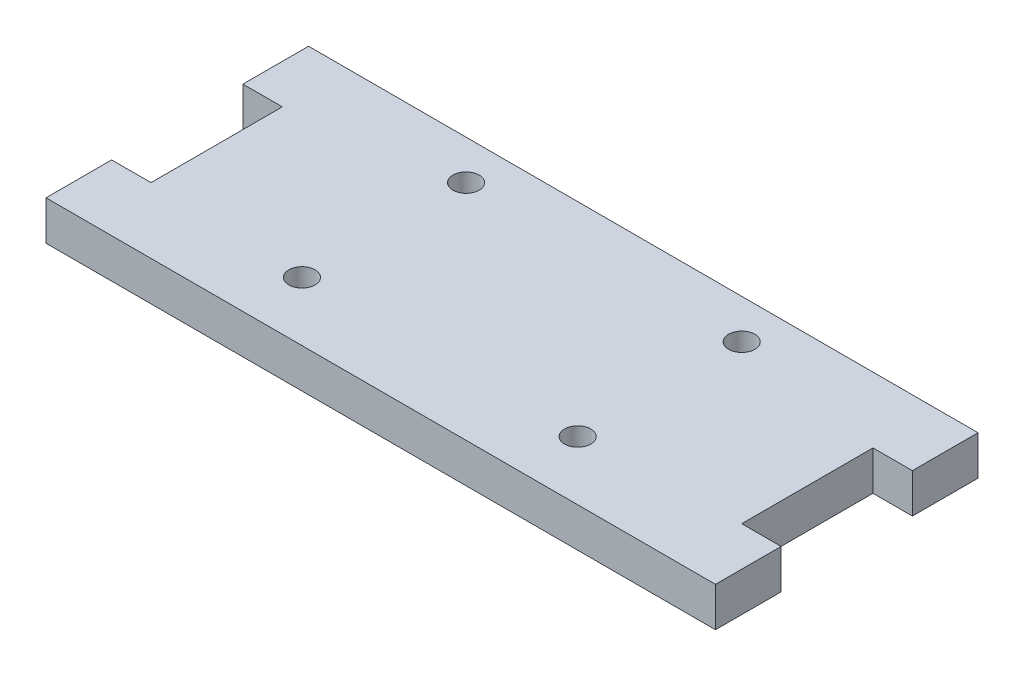
ISO-10303-21;
HEADER;
FILE_DESCRIPTION(('STEP AP214'),'2;1');
FILE_NAME('part.step','',(''),(''),'','','');
FILE_SCHEMA(('AUTOMOTIVE_DESIGN { 1 0 10303 214 1 1 1 1 }'));
ENDSEC;
DATA;
#1=APPLICATION_CONTEXT('core data for automotive mechanical design processes');
#2=APPLICATION_PROTOCOL_DEFINITION('international standard','automotive_design',2000,#1);
#3=PRODUCT_CONTEXT('',#1,'mechanical');
#4=PRODUCT('Part','Part','',(#3));
#5=PRODUCT_RELATED_PRODUCT_CATEGORY('part','',(#4));
#6=PRODUCT_DEFINITION_FORMATION('','',#4);
#7=PRODUCT_DEFINITION_CONTEXT('part definition',#1,'design');
#8=PRODUCT_DEFINITION('design','',#6,#7);
#9=PRODUCT_DEFINITION_SHAPE('','',#8);
#10=(LENGTH_UNIT() NAMED_UNIT(*) SI_UNIT(.MILLI.,.METRE.));
#11=(NAMED_UNIT(*) PLANE_ANGLE_UNIT() SI_UNIT($,.RADIAN.));
#12=(NAMED_UNIT(*) SI_UNIT($,.STERADIAN.) SOLID_ANGLE_UNIT());
#13=UNCERTAINTY_MEASURE_WITH_UNIT(LENGTH_MEASURE(1.E-05),#10,'distance_accuracy_value','');
#14=(GEOMETRIC_REPRESENTATION_CONTEXT(3) GLOBAL_UNCERTAINTY_ASSIGNED_CONTEXT((#13)) GLOBAL_UNIT_ASSIGNED_CONTEXT((#10,
#11,#12)) REPRESENTATION_CONTEXT('',''));
#15=CARTESIAN_POINT('',(0.,0.,0.));
#16=DIRECTION('',(0.,0.,1.));
#17=DIRECTION('',(1.,0.,0.));
#18=AXIS2_PLACEMENT_3D('',#15,#16,#17);
#19=CARTESIAN_POINT('',(0.,3.,-20.));
#20=DIRECTION('',(0.,0.,1.));
#21=DIRECTION('',(1.,0.,0.));
#22=AXIS2_PLACEMENT_3D('',#19,#20,#21);
#23=PLANE('',#22);
#24=DIRECTION('',(-1.,0.,0.));
#25=VECTOR('',#24,1.);
#26=CARTESIAN_POINT('',(0.,0.,-20.));
#27=LINE('',#26,#25);
#28=CARTESIAN_POINT('',(48.,0.,-20.));
#29=VERTEX_POINT('',#28);
#30=CARTESIAN_POINT('',(-3.,0.,-20.));
#31=VERTEX_POINT('',#30);
#32=EDGE_CURVE('E183',#29,#31,#27,.T.);
#33=ORIENTED_EDGE('',*,*,#32,.T.);
#34=DIRECTION('',(0.,-1.,0.));
#35=VECTOR('',#34,1.);
#36=CARTESIAN_POINT('',(-3.,3.,-20.));
#37=LINE('',#36,#35);
#38=CARTESIAN_POINT('',(-3.,3.,-20.));
#39=VERTEX_POINT('',#38);
#40=EDGE_CURVE('E11',#39,#31,#37,.T.);
#41=ORIENTED_EDGE('',*,*,#40,.F.);
#42=DIRECTION('',(-1.,0.,0.));
#43=VECTOR('',#42,1.);
#44=CARTESIAN_POINT('',(0.,3.,-20.));
#45=LINE('',#44,#43);
#46=CARTESIAN_POINT('',(48.,3.,-20.));
#47=VERTEX_POINT('',#46);
#48=EDGE_CURVE('E242',#47,#39,#45,.T.);
#49=ORIENTED_EDGE('',*,*,#48,.F.);
#50=DIRECTION('',(0.,-1.,0.));
#51=VECTOR('',#50,1.);
#52=CARTESIAN_POINT('',(48.,3.,-20.));
#53=LINE('',#52,#51);
#54=EDGE_CURVE('E58',#47,#29,#53,.T.);
#55=ORIENTED_EDGE('',*,*,#54,.T.);
#56=EDGE_LOOP('',(#33,#41,#49,#55));
#57=FACE_BOUND('',#56,.T.);
#58=ADVANCED_FACE('F41',(#57),#23,.F.);
#59=CARTESIAN_POINT('',(-3.,3.,0.));
#60=DIRECTION('',(1.,0.,0.));
#61=DIRECTION('',(0.,0.,-1.));
#62=AXIS2_PLACEMENT_3D('',#59,#60,#61);
#63=PLANE('',#62);
#64=DIRECTION('',(0.,0.,1.));
#65=VECTOR('',#64,1.);
#66=CARTESIAN_POINT('',(-3.,0.,0.));
#67=LINE('',#66,#65);
#68=CARTESIAN_POINT('',(-3.,0.,-15.));
#69=VERTEX_POINT('',#68);
#70=EDGE_CURVE('E186',#31,#69,#67,.T.);
#71=ORIENTED_EDGE('',*,*,#70,.T.);
#72=DIRECTION('',(0.,-1.,0.));
#73=VECTOR('',#72,1.);
#74=CARTESIAN_POINT('',(-3.,3.,-15.));
#75=LINE('',#74,#73);
#76=CARTESIAN_POINT('',(-3.,3.,-15.));
#77=VERTEX_POINT('',#76);
#78=EDGE_CURVE('E50',#77,#69,#75,.T.);
#79=ORIENTED_EDGE('',*,*,#78,.F.);
#80=DIRECTION('',(0.,0.,1.));
#81=VECTOR('',#80,1.);
#82=CARTESIAN_POINT('',(-3.,3.,0.));
#83=LINE('',#82,#81);
#84=EDGE_CURVE('E109',#39,#77,#83,.T.);
#85=ORIENTED_EDGE('',*,*,#84,.F.);
#86=ORIENTED_EDGE('',*,*,#40,.T.);
#87=EDGE_LOOP('',(#71,#79,#85,#86));
#88=FACE_BOUND('',#87,.T.);
#89=ADVANCED_FACE('F274',(#88),#63,.F.);
#90=CARTESIAN_POINT('',(0.,3.,-15.));
#91=DIRECTION('',(0.,0.,1.));
#92=DIRECTION('',(1.,0.,0.));
#93=AXIS2_PLACEMENT_3D('',#90,#91,#92);
#94=PLANE('',#93);
#95=DIRECTION('',(-1.,0.,0.));
#96=VECTOR('',#95,1.);
#97=CARTESIAN_POINT('',(0.,0.,-15.));
#98=LINE('',#97,#96);
#99=CARTESIAN_POINT('',(0.,0.,-15.));
#100=VERTEX_POINT('',#99);
#101=EDGE_CURVE('E190',#100,#69,#98,.T.);
#102=ORIENTED_EDGE('',*,*,#101,.F.);
#103=DIRECTION('',(0.,-1.,0.));
#104=VECTOR('',#103,1.);
#105=CARTESIAN_POINT('',(0.,3.,-15.));
#106=LINE('',#105,#104);
#107=CARTESIAN_POINT('',(0.,3.,-15.));
#108=VERTEX_POINT('',#107);
#109=EDGE_CURVE('E265',#108,#100,#106,.T.);
#110=ORIENTED_EDGE('',*,*,#109,.F.);
#111=DIRECTION('',(-1.,0.,0.));
#112=VECTOR('',#111,1.);
#113=CARTESIAN_POINT('',(0.,3.,-15.));
#114=LINE('',#113,#112);
#115=EDGE_CURVE('E273',#108,#77,#114,.T.);
#116=ORIENTED_EDGE('',*,*,#115,.T.);
#117=ORIENTED_EDGE('',*,*,#78,.T.);
#118=EDGE_LOOP('',(#102,#110,#116,#117));
#119=FACE_BOUND('',#118,.T.);
#120=ADVANCED_FACE('F271',(#119),#94,.T.);
#121=CARTESIAN_POINT('',(0.,3.,0.));
#122=DIRECTION('',(-1.,0.,0.));
#123=DIRECTION('',(0.,0.,1.));
#124=AXIS2_PLACEMENT_3D('',#121,#122,#123);
#125=PLANE('',#124);
#126=DIRECTION('',(0.,0.,-1.));
#127=VECTOR('',#126,1.);
#128=CARTESIAN_POINT('',(0.,0.,0.));
#129=LINE('',#128,#127);
#130=CARTESIAN_POINT('',(0.,0.,-5.));
#131=VERTEX_POINT('',#130);
#132=EDGE_CURVE('E194',#131,#100,#129,.T.);
#133=ORIENTED_EDGE('',*,*,#132,.F.);
#134=DIRECTION('',(0.,-1.,0.));
#135=VECTOR('',#134,1.);
#136=CARTESIAN_POINT('',(0.,3.,-5.));
#137=LINE('',#136,#135);
#138=CARTESIAN_POINT('',(0.,3.,-5.));
#139=VERTEX_POINT('',#138);
#140=EDGE_CURVE('E262',#139,#131,#137,.T.);
#141=ORIENTED_EDGE('',*,*,#140,.F.);
#142=DIRECTION('',(0.,0.,-1.));
#143=VECTOR('',#142,1.);
#144=CARTESIAN_POINT('',(0.,3.,0.));
#145=LINE('',#144,#143);
#146=EDGE_CURVE('E286',#139,#108,#145,.T.);
#147=ORIENTED_EDGE('',*,*,#146,.T.);
#148=ORIENTED_EDGE('',*,*,#109,.T.);
#149=EDGE_LOOP('',(#133,#141,#147,#148));
#150=FACE_BOUND('',#149,.T.);
#151=ADVANCED_FACE('F282',(#150),#125,.T.);
#152=CARTESIAN_POINT('',(0.,3.,-5.));
#153=DIRECTION('',(0.,0.,1.));
#154=DIRECTION('',(1.,0.,0.));
#155=AXIS2_PLACEMENT_3D('',#152,#153,#154);
#156=PLANE('',#155);
#157=DIRECTION('',(-1.,0.,0.));
#158=VECTOR('',#157,1.);
#159=CARTESIAN_POINT('',(0.,0.,-5.));
#160=LINE('',#159,#158);
#161=CARTESIAN_POINT('',(-3.,0.,-5.));
#162=VERTEX_POINT('',#161);
#163=EDGE_CURVE('E198',#131,#162,#160,.T.);
#164=ORIENTED_EDGE('',*,*,#163,.T.);
#165=DIRECTION('',(0.,-1.,0.));
#166=VECTOR('',#165,1.);
#167=CARTESIAN_POINT('',(-3.,3.,-5.));
#168=LINE('',#167,#166);
#169=CARTESIAN_POINT('',(-3.,3.,-5.));
#170=VERTEX_POINT('',#169);
#171=EDGE_CURVE('E259',#170,#162,#168,.T.);
#172=ORIENTED_EDGE('',*,*,#171,.F.);
#173=DIRECTION('',(-1.,0.,0.));
#174=VECTOR('',#173,1.);
#175=CARTESIAN_POINT('',(0.,3.,-5.));
#176=LINE('',#175,#174);
#177=EDGE_CURVE('E291',#139,#170,#176,.T.);
#178=ORIENTED_EDGE('',*,*,#177,.F.);
#179=ORIENTED_EDGE('',*,*,#140,.T.);
#180=EDGE_LOOP('',(#164,#172,#178,#179));
#181=FACE_BOUND('',#180,.T.);
#182=ADVANCED_FACE('F340',(#181),#156,.F.);
#183=CARTESIAN_POINT('',(-3.,3.,0.));
#184=DIRECTION('',(-1.,0.,0.));
#185=DIRECTION('',(0.,0.,1.));
#186=AXIS2_PLACEMENT_3D('',#183,#184,#185);
#187=PLANE('',#186);
#188=DIRECTION('',(0.,0.,-1.));
#189=VECTOR('',#188,1.);
#190=CARTESIAN_POINT('',(-3.,0.,0.));
#191=LINE('',#190,#189);
#192=CARTESIAN_POINT('',(-3.,0.,0.));
#193=VERTEX_POINT('',#192);
#194=EDGE_CURVE('E202',#193,#162,#191,.T.);
#195=ORIENTED_EDGE('',*,*,#194,.F.);
#196=DIRECTION('',(0.,-1.,0.));
#197=VECTOR('',#196,1.);
#198=CARTESIAN_POINT('',(-3.,3.,0.));
#199=LINE('',#198,#197);
#200=CARTESIAN_POINT('',(-3.,3.,0.));
#201=VERTEX_POINT('',#200);
#202=EDGE_CURVE('E256',#201,#193,#199,.T.);
#203=ORIENTED_EDGE('',*,*,#202,.F.);
#204=DIRECTION('',(0.,0.,-1.));
#205=VECTOR('',#204,1.);
#206=CARTESIAN_POINT('',(-3.,3.,0.));
#207=LINE('',#206,#205);
#208=EDGE_CURVE('E298',#201,#170,#207,.T.);
#209=ORIENTED_EDGE('',*,*,#208,.T.);
#210=ORIENTED_EDGE('',*,*,#171,.T.);
#211=EDGE_LOOP('',(#195,#203,#209,#210));
#212=FACE_BOUND('',#211,.T.);
#213=ADVANCED_FACE('F343',(#212),#187,.T.);
#214=CARTESIAN_POINT('',(0.,3.,0.));
#215=DIRECTION('',(0.,0.,-1.));
#216=DIRECTION('',(-1.,0.,0.));
#217=AXIS2_PLACEMENT_3D('',#214,#215,#216);
#218=PLANE('',#217);
#219=DIRECTION('',(1.,0.,0.));
#220=VECTOR('',#219,1.);
#221=CARTESIAN_POINT('',(0.,0.,0.));
#222=LINE('',#221,#220);
#223=CARTESIAN_POINT('',(48.,0.,0.));
#224=VERTEX_POINT('',#223);
#225=EDGE_CURVE('E206',#193,#224,#222,.T.);
#226=ORIENTED_EDGE('',*,*,#225,.T.);
#227=DIRECTION('',(0.,-1.,0.));
#228=VECTOR('',#227,1.);
#229=CARTESIAN_POINT('',(48.,3.,0.));
#230=LINE('',#229,#228);
#231=CARTESIAN_POINT('',(48.,3.,0.));
#232=VERTEX_POINT('',#231);
#233=EDGE_CURVE('E252',#232,#224,#230,.T.);
#234=ORIENTED_EDGE('',*,*,#233,.F.);
#235=DIRECTION('',(1.,0.,0.));
#236=VECTOR('',#235,1.);
#237=CARTESIAN_POINT('',(0.,3.,0.));
#238=LINE('',#237,#236);
#239=EDGE_CURVE('E302',#201,#232,#238,.T.);
#240=ORIENTED_EDGE('',*,*,#239,.F.);
#241=ORIENTED_EDGE('',*,*,#202,.T.);
#242=EDGE_LOOP('',(#226,#234,#240,#241));
#243=FACE_BOUND('',#242,.T.);
#244=ADVANCED_FACE('F347',(#243),#218,.F.);
#245=CARTESIAN_POINT('',(48.,3.,0.));
#246=DIRECTION('',(-1.,0.,0.));
#247=DIRECTION('',(0.,0.,1.));
#248=AXIS2_PLACEMENT_3D('',#245,#246,#247);
#249=PLANE('',#248);
#250=DIRECTION('',(0.,0.,-1.));
#251=VECTOR('',#250,1.);
#252=CARTESIAN_POINT('',(48.,0.,0.));
#253=LINE('',#252,#251);
#254=CARTESIAN_POINT('',(48.,0.,-5.00000000000001));
#255=VERTEX_POINT('',#254);
#256=EDGE_CURVE('E209',#224,#255,#253,.T.);
#257=ORIENTED_EDGE('',*,*,#256,.T.);
#258=DIRECTION('',(0.,-1.,0.));
#259=VECTOR('',#258,1.);
#260=CARTESIAN_POINT('',(48.,3.,-5.00000000000001));
#261=LINE('',#260,#259);
#262=CARTESIAN_POINT('',(48.,3.,-5.00000000000001));
#263=VERTEX_POINT('',#262);
#264=EDGE_CURVE('E249',#263,#255,#261,.T.);
#265=ORIENTED_EDGE('',*,*,#264,.F.);
#266=DIRECTION('',(0.,0.,-1.));
#267=VECTOR('',#266,1.);
#268=CARTESIAN_POINT('',(48.,3.,0.));
#269=LINE('',#268,#267);
#270=EDGE_CURVE('E305',#232,#263,#269,.T.);
#271=ORIENTED_EDGE('',*,*,#270,.F.);
#272=ORIENTED_EDGE('',*,*,#233,.T.);
#273=EDGE_LOOP('',(#257,#265,#271,#272));
#274=FACE_BOUND('',#273,.T.);
#275=ADVANCED_FACE('F351',(#274),#249,.F.);
#276=CARTESIAN_POINT('',(0.,3.,-4.99999999999995));
#277=DIRECTION('',(0.,0.,-1.));
#278=DIRECTION('',(-1.,0.,0.));
#279=AXIS2_PLACEMENT_3D('',#276,#277,#278);
#280=PLANE('',#279);
#281=DIRECTION('',(1.,0.,0.));
#282=VECTOR('',#281,1.);
#283=CARTESIAN_POINT('',(0.,0.,-4.99999999999995));
#284=LINE('',#283,#282);
#285=CARTESIAN_POINT('',(45.,0.,-5.00000000000001));
#286=VERTEX_POINT('',#285);
#287=EDGE_CURVE('E213',#286,#255,#284,.T.);
#288=ORIENTED_EDGE('',*,*,#287,.F.);
#289=DIRECTION('',(0.,-1.,0.));
#290=VECTOR('',#289,1.);
#291=CARTESIAN_POINT('',(45.,3.,-5.00000000000001));
#292=LINE('',#291,#290);
#293=CARTESIAN_POINT('',(45.,3.,-5.00000000000001));
#294=VERTEX_POINT('',#293);
#295=EDGE_CURVE('E157',#294,#286,#292,.T.);
#296=ORIENTED_EDGE('',*,*,#295,.F.);
#297=DIRECTION('',(1.,0.,0.));
#298=VECTOR('',#297,1.);
#299=CARTESIAN_POINT('',(0.,3.,-4.99999999999995));
#300=LINE('',#299,#298);
#301=EDGE_CURVE('E145',#294,#263,#300,.T.);
#302=ORIENTED_EDGE('',*,*,#301,.T.);
#303=ORIENTED_EDGE('',*,*,#264,.T.);
#304=EDGE_LOOP('',(#288,#296,#302,#303));
#305=FACE_BOUND('',#304,.T.);
#306=ADVANCED_FACE('F310',(#305),#280,.T.);
#307=CARTESIAN_POINT('',(45.,3.,0.));
#308=DIRECTION('',(-1.,0.,0.));
#309=DIRECTION('',(0.,0.,1.));
#310=AXIS2_PLACEMENT_3D('',#307,#308,#309);
#311=PLANE('',#310);
#312=DIRECTION('',(0.,0.,-1.));
#313=VECTOR('',#312,1.);
#314=CARTESIAN_POINT('',(45.,0.,0.));
#315=LINE('',#314,#313);
#316=CARTESIAN_POINT('',(45.,0.,-15.));
#317=VERTEX_POINT('',#316);
#318=EDGE_CURVE('E153',#286,#317,#315,.T.);
#319=ORIENTED_EDGE('',*,*,#318,.T.);
#320=DIRECTION('',(0.,-1.,0.));
#321=VECTOR('',#320,1.);
#322=CARTESIAN_POINT('',(45.,3.,-15.));
#323=LINE('',#322,#321);
#324=CARTESIAN_POINT('',(45.,3.,-15.));
#325=VERTEX_POINT('',#324);
#326=EDGE_CURVE('E150',#325,#317,#323,.T.);
#327=ORIENTED_EDGE('',*,*,#326,.F.);
#328=DIRECTION('',(0.,0.,-1.));
#329=VECTOR('',#328,1.);
#330=CARTESIAN_POINT('',(45.,3.,0.));
#331=LINE('',#330,#329);
#332=EDGE_CURVE('E137',#294,#325,#331,.T.);
#333=ORIENTED_EDGE('',*,*,#332,.F.);
#334=ORIENTED_EDGE('',*,*,#295,.T.);
#335=EDGE_LOOP('',(#319,#327,#333,#334));
#336=FACE_BOUND('',#335,.T.);
#337=ADVANCED_FACE('F151',(#336),#311,.F.);
#338=CARTESIAN_POINT('',(0.,3.,-15.));
#339=DIRECTION('',(0.,0.,-1.));
#340=DIRECTION('',(-1.,0.,0.));
#341=AXIS2_PLACEMENT_3D('',#338,#339,#340);
#342=PLANE('',#341);
#343=DIRECTION('',(1.,0.,0.));
#344=VECTOR('',#343,1.);
#345=CARTESIAN_POINT('',(0.,0.,-15.));
#346=LINE('',#345,#344);
#347=CARTESIAN_POINT('',(48.,0.,-15.));
#348=VERTEX_POINT('',#347);
#349=EDGE_CURVE('E219',#317,#348,#346,.T.);
#350=ORIENTED_EDGE('',*,*,#349,.T.);
#351=DIRECTION('',(0.,-1.,0.));
#352=VECTOR('',#351,1.);
#353=CARTESIAN_POINT('',(48.,3.,-15.));
#354=LINE('',#353,#352);
#355=CARTESIAN_POINT('',(48.,3.,-15.));
#356=VERTEX_POINT('',#355);
#357=EDGE_CURVE('E97',#356,#348,#354,.T.);
#358=ORIENTED_EDGE('',*,*,#357,.F.);
#359=DIRECTION('',(1.,0.,0.));
#360=VECTOR('',#359,1.);
#361=CARTESIAN_POINT('',(0.,3.,-15.));
#362=LINE('',#361,#360);
#363=EDGE_CURVE('E143',#325,#356,#362,.T.);
#364=ORIENTED_EDGE('',*,*,#363,.F.);
#365=ORIENTED_EDGE('',*,*,#326,.T.);
#366=EDGE_LOOP('',(#350,#358,#364,#365));
#367=FACE_BOUND('',#366,.T.);
#368=ADVANCED_FACE('F159',(#367),#342,.F.);
#369=CARTESIAN_POINT('',(33.,3.,-4.5));
#370=DIRECTION('',(0.,-1.,0.));
#371=DIRECTION('',(0.,0.,-1.));
#372=AXIS2_PLACEMENT_3D('',#369,#370,#371);
#373=CYLINDRICAL_SURFACE('',#372,0.999999999999998);
#374=CARTESIAN_POINT('',(33.,3.,-4.5));
#375=DIRECTION('',(0.,1.,0.));
#376=DIRECTION('',(0.,0.,1.));
#377=AXIS2_PLACEMENT_3D('',#374,#375,#376);
#378=CIRCLE('',#377,0.999999999999998);
#379=CARTESIAN_POINT('',(33.,3.,-3.50000000000001));
#380=VERTEX_POINT('',#379);
#381=EDGE_CURVE('E175',#380,#380,#378,.F.);
#382=ORIENTED_EDGE('',*,*,#381,.F.);
#383=EDGE_LOOP('',(#382));
#384=FACE_BOUND('',#383,.T.);
#385=CARTESIAN_POINT('',(33.,0.,-4.5));
#386=DIRECTION('',(0.,1.,0.));
#387=DIRECTION('',(0.,0.,1.));
#388=AXIS2_PLACEMENT_3D('',#385,#386,#387);
#389=CIRCLE('',#388,0.999999999999998);
#390=CARTESIAN_POINT('',(33.,0.,-3.50000000000001));
#391=VERTEX_POINT('',#390);
#392=EDGE_CURVE('E234',#391,#391,#389,.F.);
#393=ORIENTED_EDGE('',*,*,#392,.T.);
#394=EDGE_LOOP('',(#393));
#395=FACE_BOUND('',#394,.T.);
#396=ADVANCED_FACE('F360',(#384,#395),#373,.F.);
#397=CARTESIAN_POINT('',(12.,3.,-17.));
#398=DIRECTION('',(0.,-1.,0.));
#399=DIRECTION('',(0.,0.,-1.));
#400=AXIS2_PLACEMENT_3D('',#397,#398,#399);
#401=CYLINDRICAL_SURFACE('',#400,1.);
#402=CARTESIAN_POINT('',(12.,3.,-17.));
#403=DIRECTION('',(0.,1.,0.));
#404=DIRECTION('',(0.,0.,1.));
#405=AXIS2_PLACEMENT_3D('',#402,#403,#404);
#406=CIRCLE('',#405,1.);
#407=CARTESIAN_POINT('',(12.,3.,-16.));
#408=VERTEX_POINT('',#407);
#409=EDGE_CURVE('E171',#408,#408,#406,.T.);
#410=ORIENTED_EDGE('',*,*,#409,.T.);
#411=EDGE_LOOP('',(#410));
#412=FACE_BOUND('',#411,.T.);
#413=CARTESIAN_POINT('',(12.,0.,-17.));
#414=DIRECTION('',(0.,1.,0.));
#415=DIRECTION('',(0.,0.,1.));
#416=AXIS2_PLACEMENT_3D('',#413,#414,#415);
#417=CIRCLE('',#416,1.);
#418=CARTESIAN_POINT('',(12.,0.,-16.));
#419=VERTEX_POINT('',#418);
#420=EDGE_CURVE('E230',#419,#419,#417,.T.);
#421=ORIENTED_EDGE('',*,*,#420,.F.);
#422=EDGE_LOOP('',(#421));
#423=FACE_BOUND('',#422,.T.);
#424=ADVANCED_FACE('F324',(#412,#423),#401,.F.);
#425=CARTESIAN_POINT('',(12.,3.,-4.5));
#426=DIRECTION('',(0.,-1.,0.));
#427=DIRECTION('',(0.,0.,-1.));
#428=AXIS2_PLACEMENT_3D('',#425,#426,#427);
#429=CYLINDRICAL_SURFACE('',#428,1.);
#430=CARTESIAN_POINT('',(12.,3.,-4.5));
#431=DIRECTION('',(0.,1.,0.));
#432=DIRECTION('',(0.,0.,1.));
#433=AXIS2_PLACEMENT_3D('',#430,#431,#432);
#434=CIRCLE('',#433,1.);
#435=CARTESIAN_POINT('',(12.,3.,-3.5));
#436=VERTEX_POINT('',#435);
#437=EDGE_CURVE('E164',#436,#436,#434,.T.);
#438=ORIENTED_EDGE('',*,*,#437,.T.);
#439=EDGE_LOOP('',(#438));
#440=FACE_BOUND('',#439,.T.);
#441=CARTESIAN_POINT('',(12.,0.,-4.5));
#442=DIRECTION('',(0.,1.,0.));
#443=DIRECTION('',(0.,0.,1.));
#444=AXIS2_PLACEMENT_3D('',#441,#442,#443);
#445=CIRCLE('',#444,1.);
#446=CARTESIAN_POINT('',(12.,0.,-3.5));
#447=VERTEX_POINT('',#446);
#448=EDGE_CURVE('E226',#447,#447,#445,.T.);
#449=ORIENTED_EDGE('',*,*,#448,.F.);
#450=EDGE_LOOP('',(#449));
#451=FACE_BOUND('',#450,.T.);
#452=ADVANCED_FACE('F316',(#440,#451),#429,.F.);
#453=CARTESIAN_POINT('',(48.,3.,0.));
#454=DIRECTION('',(1.,0.,0.));
#455=DIRECTION('',(0.,0.,-1.));
#456=AXIS2_PLACEMENT_3D('',#453,#454,#455);
#457=PLANE('',#456);
#458=DIRECTION('',(0.,0.,1.));
#459=VECTOR('',#458,1.);
#460=CARTESIAN_POINT('',(48.,0.,0.));
#461=LINE('',#460,#459);
#462=EDGE_CURVE('E222',#29,#348,#461,.T.);
#463=ORIENTED_EDGE('',*,*,#462,.F.);
#464=ORIENTED_EDGE('',*,*,#54,.F.);
#465=DIRECTION('',(0.,0.,1.));
#466=VECTOR('',#465,1.);
#467=CARTESIAN_POINT('',(48.,3.,0.));
#468=LINE('',#467,#466);
#469=EDGE_CURVE('E161',#47,#356,#468,.T.);
#470=ORIENTED_EDGE('',*,*,#469,.T.);
#471=ORIENTED_EDGE('',*,*,#357,.T.);
#472=EDGE_LOOP('',(#463,#464,#470,#471));
#473=FACE_BOUND('',#472,.T.);
#474=ADVANCED_FACE('F313',(#473),#457,.T.);
#475=CARTESIAN_POINT('',(33.,3.,-17.));
#476=DIRECTION('',(0.,-1.,0.));
#477=DIRECTION('',(0.,0.,-1.));
#478=AXIS2_PLACEMENT_3D('',#475,#476,#477);
#479=CYLINDRICAL_SURFACE('',#478,1.00000000000001);
#480=CARTESIAN_POINT('',(33.,3.,-17.));
#481=DIRECTION('',(0.,1.,0.));
#482=DIRECTION('',(0.,0.,1.));
#483=AXIS2_PLACEMENT_3D('',#480,#481,#482);
#484=CIRCLE('',#483,1.00000000000001);
#485=CARTESIAN_POINT('',(33.,3.,-16.));
#486=VERTEX_POINT('',#485);
#487=EDGE_CURVE('E179',#486,#486,#484,.F.);
#488=ORIENTED_EDGE('',*,*,#487,.F.);
#489=EDGE_LOOP('',(#488));
#490=FACE_BOUND('',#489,.T.);
#491=CARTESIAN_POINT('',(33.,0.,-17.));
#492=DIRECTION('',(0.,1.,0.));
#493=DIRECTION('',(0.,0.,1.));
#494=AXIS2_PLACEMENT_3D('',#491,#492,#493);
#495=CIRCLE('',#494,1.00000000000001);
#496=CARTESIAN_POINT('',(33.,0.,-16.));
#497=VERTEX_POINT('',#496);
#498=EDGE_CURVE('E238',#497,#497,#495,.F.);
#499=ORIENTED_EDGE('',*,*,#498,.T.);
#500=EDGE_LOOP('',(#499));
#501=FACE_BOUND('',#500,.T.);
#502=ADVANCED_FACE('F315',(#490,#501),#479,.F.);
#503=CARTESIAN_POINT('',(0.,3.,0.));
#504=DIRECTION('',(0.,1.,0.));
#505=DIRECTION('',(0.,0.,1.));
#506=AXIS2_PLACEMENT_3D('',#503,#504,#505);
#507=PLANE('',#506);
#508=ORIENTED_EDGE('',*,*,#48,.T.);
#509=ORIENTED_EDGE('',*,*,#84,.T.);
#510=ORIENTED_EDGE('',*,*,#115,.F.);
#511=ORIENTED_EDGE('',*,*,#146,.F.);
#512=ORIENTED_EDGE('',*,*,#177,.T.);
#513=ORIENTED_EDGE('',*,*,#208,.F.);
#514=ORIENTED_EDGE('',*,*,#239,.T.);
#515=ORIENTED_EDGE('',*,*,#270,.T.);
#516=ORIENTED_EDGE('',*,*,#301,.F.);
#517=ORIENTED_EDGE('',*,*,#332,.T.);
#518=ORIENTED_EDGE('',*,*,#363,.T.);
#519=ORIENTED_EDGE('',*,*,#469,.F.);
#520=EDGE_LOOP('',(#508,#509,#510,#511,#512,#513,#514,#515,#516,#517,#518,#519));
#521=FACE_BOUND('',#520,.T.);
#522=ORIENTED_EDGE('',*,*,#437,.F.);
#523=EDGE_LOOP('',(#522));
#524=FACE_BOUND('',#523,.T.);
#525=ORIENTED_EDGE('',*,*,#409,.F.);
#526=EDGE_LOOP('',(#525));
#527=FACE_BOUND('',#526,.T.);
#528=ORIENTED_EDGE('',*,*,#381,.T.);
#529=EDGE_LOOP('',(#528));
#530=FACE_BOUND('',#529,.T.);
#531=ORIENTED_EDGE('',*,*,#487,.T.);
#532=EDGE_LOOP('',(#531));
#533=FACE_BOUND('',#532,.T.);
#534=ADVANCED_FACE('F139',(#521,#524,#527,#530,#533),#507,.T.);
#535=CARTESIAN_POINT('',(0.,0.,0.));
#536=DIRECTION('',(0.,1.,0.));
#537=DIRECTION('',(0.,0.,1.));
#538=AXIS2_PLACEMENT_3D('',#535,#536,#537);
#539=PLANE('',#538);
#540=ORIENTED_EDGE('',*,*,#32,.F.);
#541=ORIENTED_EDGE('',*,*,#462,.T.);
#542=ORIENTED_EDGE('',*,*,#349,.F.);
#543=ORIENTED_EDGE('',*,*,#318,.F.);
#544=ORIENTED_EDGE('',*,*,#287,.T.);
#545=ORIENTED_EDGE('',*,*,#256,.F.);
#546=ORIENTED_EDGE('',*,*,#225,.F.);
#547=ORIENTED_EDGE('',*,*,#194,.T.);
#548=ORIENTED_EDGE('',*,*,#163,.F.);
#549=ORIENTED_EDGE('',*,*,#132,.T.);
#550=ORIENTED_EDGE('',*,*,#101,.T.);
#551=ORIENTED_EDGE('',*,*,#70,.F.);
#552=EDGE_LOOP('',(#540,#541,#542,#543,#544,#545,#546,#547,#548,#549,#550,#551));
#553=FACE_BOUND('',#552,.T.);
#554=ORIENTED_EDGE('',*,*,#448,.T.);
#555=EDGE_LOOP('',(#554));
#556=FACE_BOUND('',#555,.T.);
#557=ORIENTED_EDGE('',*,*,#420,.T.);
#558=EDGE_LOOP('',(#557));
#559=FACE_BOUND('',#558,.T.);
#560=ORIENTED_EDGE('',*,*,#392,.F.);
#561=EDGE_LOOP('',(#560));
#562=FACE_BOUND('',#561,.T.);
#563=ORIENTED_EDGE('',*,*,#498,.F.);
#564=EDGE_LOOP('',(#563));
#565=FACE_BOUND('',#564,.T.);
#566=ADVANCED_FACE('F277',(#553,#556,#559,#562,#565),#539,.F.);
#567=CLOSED_SHELL('',(#58,#89,#120,#151,#182,#213,#244,#275,#306,#337,#368,#396,#424,#452,#474,
#502,#534,#566));
#568=MANIFOLD_SOLID_BREP('B2',#567);
#569=ADVANCED_BREP_SHAPE_REPRESENTATION('',(#18,#568),#14);
#570=SHAPE_DEFINITION_REPRESENTATION(#9,#569);
ENDSEC;
END-ISO-10303-21;
